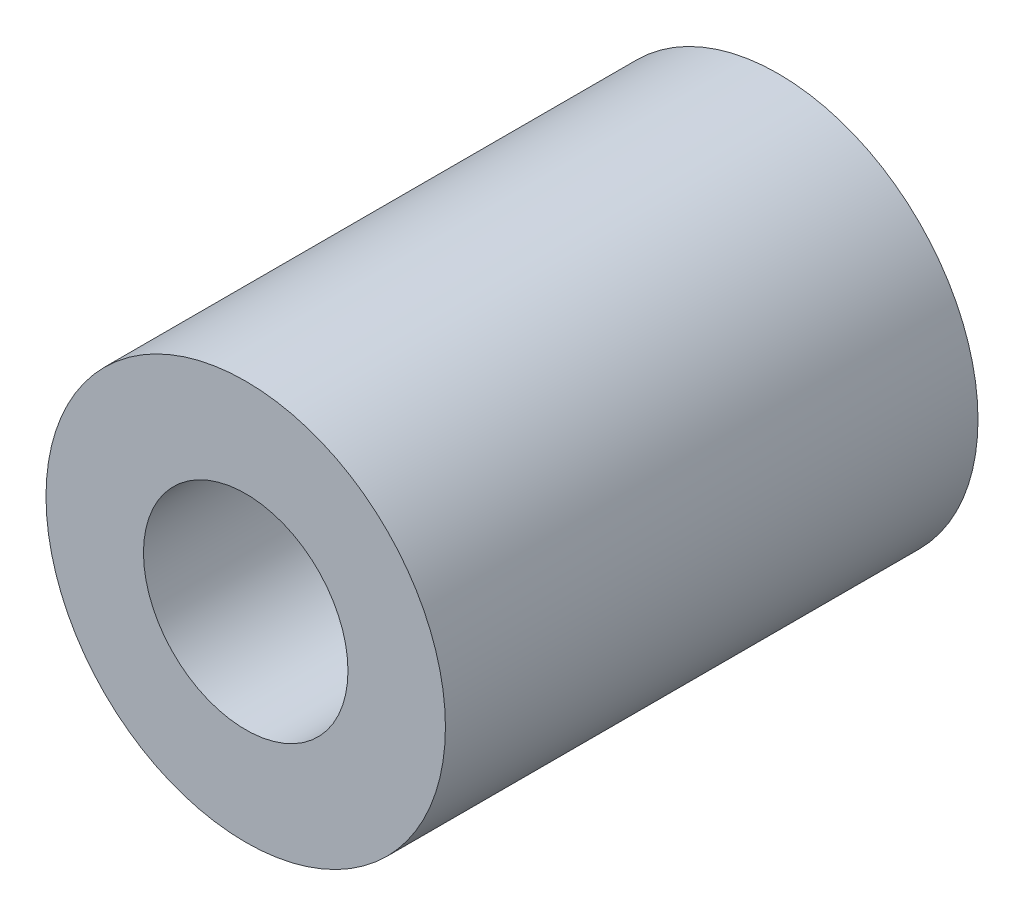
ISO-10303-21;
HEADER;
FILE_DESCRIPTION(('STEP AP214'),'2;1');
FILE_NAME('part.step','',(''),(''),'','','');
FILE_SCHEMA(('AUTOMOTIVE_DESIGN { 1 0 10303 214 1 1 1 1 }'));
ENDSEC;
DATA;
#1=APPLICATION_CONTEXT('core data for automotive mechanical design processes');
#2=APPLICATION_PROTOCOL_DEFINITION('international standard','automotive_design',2000,#1);
#3=PRODUCT_CONTEXT('',#1,'mechanical');
#4=PRODUCT('Part','Part','',(#3));
#5=PRODUCT_RELATED_PRODUCT_CATEGORY('part','',(#4));
#6=PRODUCT_DEFINITION_FORMATION('','',#4);
#7=PRODUCT_DEFINITION_CONTEXT('part definition',#1,'design');
#8=PRODUCT_DEFINITION('design','',#6,#7);
#9=PRODUCT_DEFINITION_SHAPE('','',#8);
#10=(LENGTH_UNIT() NAMED_UNIT(*) SI_UNIT(.MILLI.,.METRE.));
#11=(NAMED_UNIT(*) PLANE_ANGLE_UNIT() SI_UNIT($,.RADIAN.));
#12=(NAMED_UNIT(*) SI_UNIT($,.STERADIAN.) SOLID_ANGLE_UNIT());
#13=UNCERTAINTY_MEASURE_WITH_UNIT(LENGTH_MEASURE(1.E-05),#10,'distance_accuracy_value','');
#14=(GEOMETRIC_REPRESENTATION_CONTEXT(3) GLOBAL_UNCERTAINTY_ASSIGNED_CONTEXT((#13)) GLOBAL_UNIT_ASSIGNED_CONTEXT((#10,
#11,#12)) REPRESENTATION_CONTEXT('',''));
#15=CARTESIAN_POINT('',(0.,0.,0.));
#16=DIRECTION('',(0.,0.,1.));
#17=DIRECTION('',(1.,0.,0.));
#18=AXIS2_PLACEMENT_3D('',#15,#16,#17);
#19=CARTESIAN_POINT('',(0.,0.,6.35));
#20=DIRECTION('',(0.,0.,1.));
#21=DIRECTION('',(1.,0.,0.));
#22=AXIS2_PLACEMENT_3D('',#19,#20,#21);
#23=PLANE('',#22);
#24=CARTESIAN_POINT('',(0.,0.,6.35));
#25=DIRECTION('',(0.,0.,1.));
#26=DIRECTION('',(1.,0.,0.));
#27=AXIS2_PLACEMENT_3D('',#24,#25,#26);
#28=CIRCLE('',#27,4.7625);
#29=CARTESIAN_POINT('',(4.7625,0.,6.35));
#30=VERTEX_POINT('',#29);
#31=EDGE_CURVE('E10',#30,#30,#28,.T.);
#32=ORIENTED_EDGE('',*,*,#31,.T.);
#33=EDGE_LOOP('',(#32));
#34=FACE_BOUND('',#33,.T.);
#35=CARTESIAN_POINT('',(0.,0.,6.35));
#36=DIRECTION('',(0.,0.,1.));
#37=DIRECTION('',(1.,0.,0.));
#38=AXIS2_PLACEMENT_3D('',#35,#36,#37);
#39=CIRCLE('',#38,2.4384);
#40=CARTESIAN_POINT('',(2.4384,0.,6.35));
#41=VERTEX_POINT('',#40);
#42=EDGE_CURVE('E44',#41,#41,#39,.T.);
#43=ORIENTED_EDGE('',*,*,#42,.F.);
#44=EDGE_LOOP('',(#43));
#45=FACE_BOUND('',#44,.T.);
#46=ADVANCED_FACE('F33',(#34,#45),#23,.T.);
#47=CARTESIAN_POINT('',(0.,0.,-6.35));
#48=DIRECTION('',(0.,0.,1.));
#49=DIRECTION('',(1.,0.,0.));
#50=AXIS2_PLACEMENT_3D('',#47,#48,#49);
#51=PLANE('',#50);
#52=CARTESIAN_POINT('',(0.,0.,-6.35));
#53=DIRECTION('',(0.,0.,1.));
#54=DIRECTION('',(1.,0.,0.));
#55=AXIS2_PLACEMENT_3D('',#52,#53,#54);
#56=CIRCLE('',#55,4.7625);
#57=CARTESIAN_POINT('',(4.7625,0.,-6.35));
#58=VERTEX_POINT('',#57);
#59=EDGE_CURVE('E37',#58,#58,#56,.T.);
#60=ORIENTED_EDGE('',*,*,#59,.F.);
#61=EDGE_LOOP('',(#60));
#62=FACE_BOUND('',#61,.T.);
#63=CARTESIAN_POINT('',(0.,0.,-6.35));
#64=DIRECTION('',(0.,0.,1.));
#65=DIRECTION('',(1.,0.,0.));
#66=AXIS2_PLACEMENT_3D('',#63,#64,#65);
#67=CIRCLE('',#66,2.4384);
#68=CARTESIAN_POINT('',(2.4384,0.,-6.35));
#69=VERTEX_POINT('',#68);
#70=EDGE_CURVE('E46',#69,#69,#67,.T.);
#71=ORIENTED_EDGE('',*,*,#70,.T.);
#72=EDGE_LOOP('',(#71));
#73=FACE_BOUND('',#72,.T.);
#74=ADVANCED_FACE('F56',(#62,#73),#51,.F.);
#75=CARTESIAN_POINT('',(0.,0.,6.35));
#76=DIRECTION('',(0.,0.,-1.));
#77=DIRECTION('',(-1.,0.,0.));
#78=AXIS2_PLACEMENT_3D('',#75,#76,#77);
#79=CYLINDRICAL_SURFACE('',#78,4.7625);
#80=ORIENTED_EDGE('',*,*,#31,.F.);
#81=EDGE_LOOP('',(#80));
#82=FACE_BOUND('',#81,.T.);
#83=ORIENTED_EDGE('',*,*,#59,.T.);
#84=EDGE_LOOP('',(#83));
#85=FACE_BOUND('',#84,.T.);
#86=ADVANCED_FACE('F35',(#82,#85),#79,.T.);
#87=CARTESIAN_POINT('',(0.,0.,6.35));
#88=DIRECTION('',(0.,0.,-1.));
#89=DIRECTION('',(-1.,0.,0.));
#90=AXIS2_PLACEMENT_3D('',#87,#88,#89);
#91=CYLINDRICAL_SURFACE('',#90,2.4384);
#92=ORIENTED_EDGE('',*,*,#42,.T.);
#93=EDGE_LOOP('',(#92));
#94=FACE_BOUND('',#93,.T.);
#95=ORIENTED_EDGE('',*,*,#70,.F.);
#96=EDGE_LOOP('',(#95));
#97=FACE_BOUND('',#96,.T.);
#98=ADVANCED_FACE('F52',(#94,#97),#91,.F.);
#99=CLOSED_SHELL('',(#46,#74,#86,#98));
#100=MANIFOLD_SOLID_BREP('B2',#99);
#101=ADVANCED_BREP_SHAPE_REPRESENTATION('',(#18,#100),#14);
#102=SHAPE_DEFINITION_REPRESENTATION(#9,#101);
ENDSEC;
END-ISO-10303-21;
